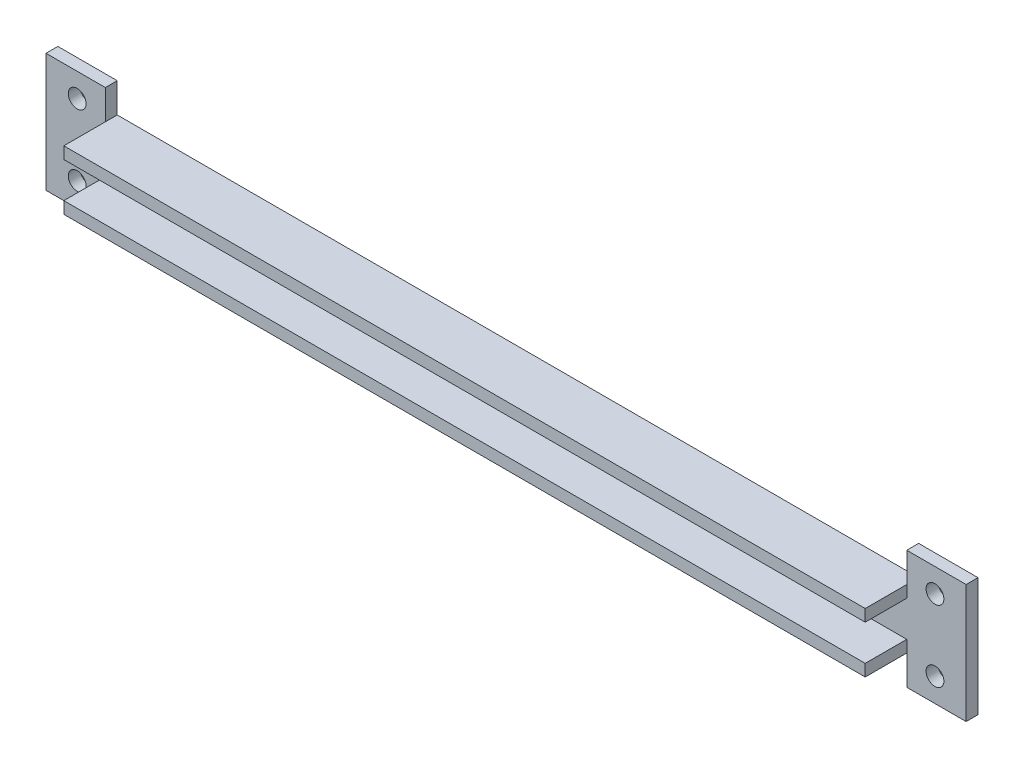
ISO-10303-21;
HEADER;
FILE_DESCRIPTION(('STEP AP214'),'2;1');
FILE_NAME('part.step','',(''),(''),'','','');
FILE_SCHEMA(('AUTOMOTIVE_DESIGN { 1 0 10303 214 1 1 1 1 }'));
ENDSEC;
DATA;
#1=APPLICATION_CONTEXT('core data for automotive mechanical design processes');
#2=APPLICATION_PROTOCOL_DEFINITION('international standard','automotive_design',2000,#1);
#3=PRODUCT_CONTEXT('',#1,'mechanical');
#4=PRODUCT('Part','Part','',(#3));
#5=PRODUCT_RELATED_PRODUCT_CATEGORY('part','',(#4));
#6=PRODUCT_DEFINITION_FORMATION('','',#4);
#7=PRODUCT_DEFINITION_CONTEXT('part definition',#1,'design');
#8=PRODUCT_DEFINITION('design','',#6,#7);
#9=PRODUCT_DEFINITION_SHAPE('','',#8);
#10=(LENGTH_UNIT() NAMED_UNIT(*) SI_UNIT(.MILLI.,.METRE.));
#11=(NAMED_UNIT(*) PLANE_ANGLE_UNIT() SI_UNIT($,.RADIAN.));
#12=(NAMED_UNIT(*) SI_UNIT($,.STERADIAN.) SOLID_ANGLE_UNIT());
#13=UNCERTAINTY_MEASURE_WITH_UNIT(LENGTH_MEASURE(1.E-05),#10,'distance_accuracy_value','');
#14=(GEOMETRIC_REPRESENTATION_CONTEXT(3) GLOBAL_UNCERTAINTY_ASSIGNED_CONTEXT((#13)) GLOBAL_UNIT_ASSIGNED_CONTEXT((#10,
#11,#12)) REPRESENTATION_CONTEXT('',''));
#15=CARTESIAN_POINT('',(0.,0.,0.));
#16=DIRECTION('',(0.,0.,1.));
#17=DIRECTION('',(1.,0.,0.));
#18=AXIS2_PLACEMENT_3D('',#15,#16,#17);
#19=CARTESIAN_POINT('',(0.,0.,9.));
#20=DIRECTION('',(0.,0.,-1.));
#21=DIRECTION('',(0.,-1.,0.));
#22=AXIS2_PLACEMENT_3D('',#19,#20,#21);
#23=PLANE('',#22);
#24=DIRECTION('',(0.,-1.,0.));
#25=VECTOR('',#24,1.);
#26=CARTESIAN_POINT('',(-73.5,23.,9.));
#27=LINE('',#26,#25);
#28=CARTESIAN_POINT('',(-73.5,25.,9.));
#29=VERTEX_POINT('',#28);
#30=CARTESIAN_POINT('',(-73.5,23.,9.));
#31=VERTEX_POINT('',#30);
#32=EDGE_CURVE('E416',#29,#31,#27,.T.);
#33=ORIENTED_EDGE('',*,*,#32,.T.);
#34=DIRECTION('',(1.,0.,0.));
#35=VECTOR('',#34,1.);
#36=CARTESIAN_POINT('',(-73.5,23.,9.));
#37=LINE('',#36,#35);
#38=CARTESIAN_POINT('',(61.5,23.,9.));
#39=VERTEX_POINT('',#38);
#40=EDGE_CURVE('E11',#31,#39,#37,.T.);
#41=ORIENTED_EDGE('',*,*,#40,.T.);
#42=DIRECTION('',(0.,1.,0.));
#43=VECTOR('',#42,1.);
#44=CARTESIAN_POINT('',(61.5,23.,9.));
#45=LINE('',#44,#43);
#46=CARTESIAN_POINT('',(61.5,25.,9.));
#47=VERTEX_POINT('',#46);
#48=EDGE_CURVE('E60',#39,#47,#45,.T.);
#49=ORIENTED_EDGE('',*,*,#48,.T.);
#50=DIRECTION('',(-1.,0.,0.));
#51=VECTOR('',#50,1.);
#52=CARTESIAN_POINT('',(-73.5,25.,9.));
#53=LINE('',#52,#51);
#54=EDGE_CURVE('E354',#47,#29,#53,.T.);
#55=ORIENTED_EDGE('',*,*,#54,.T.);
#56=EDGE_LOOP('',(#33,#41,#49,#55));
#57=FACE_BOUND('',#56,.T.);
#58=ADVANCED_FACE('F51',(#57),#23,.F.);
#59=CARTESIAN_POINT('',(-73.5,23.,0.));
#60=DIRECTION('',(0.,-1.,0.));
#61=DIRECTION('',(0.,0.,-1.));
#62=AXIS2_PLACEMENT_3D('',#59,#60,#61);
#63=PLANE('',#62);
#64=DIRECTION('',(0.,0.,1.));
#65=VECTOR('',#64,1.);
#66=CARTESIAN_POINT('',(-73.5,23.,0.));
#67=LINE('',#66,#65);
#68=CARTESIAN_POINT('',(-73.5,23.,2.));
#69=VERTEX_POINT('',#68);
#70=EDGE_CURVE('E386',#69,#31,#67,.T.);
#71=ORIENTED_EDGE('',*,*,#70,.F.);
#72=DIRECTION('',(-1.,0.,0.));
#73=VECTOR('',#72,1.);
#74=CARTESIAN_POINT('',(-73.5,23.,2.));
#75=LINE('',#74,#73);
#76=CARTESIAN_POINT('',(61.5,23.,2.));
#77=VERTEX_POINT('',#76);
#78=EDGE_CURVE('E349',#77,#69,#75,.T.);
#79=ORIENTED_EDGE('',*,*,#78,.F.);
#80=DIRECTION('',(0.,0.,1.));
#81=VECTOR('',#80,1.);
#82=CARTESIAN_POINT('',(61.5,23.,0.));
#83=LINE('',#82,#81);
#84=EDGE_CURVE('E353',#77,#39,#83,.T.);
#85=ORIENTED_EDGE('',*,*,#84,.T.);
#86=ORIENTED_EDGE('',*,*,#40,.F.);
#87=EDGE_LOOP('',(#71,#79,#85,#86));
#88=FACE_BOUND('',#87,.T.);
#89=ADVANCED_FACE('F527',(#88),#63,.T.);
#90=CARTESIAN_POINT('',(61.5,23.,0.));
#91=DIRECTION('',(1.,0.,0.));
#92=DIRECTION('',(0.,1.,0.));
#93=AXIS2_PLACEMENT_3D('',#90,#91,#92);
#94=PLANE('',#93);
#95=ORIENTED_EDGE('',*,*,#84,.F.);
#96=DIRECTION('',(0.,1.,0.));
#97=VECTOR('',#96,1.);
#98=CARTESIAN_POINT('',(61.5,4.26741975090296E-13,2.));
#99=LINE('',#98,#97);
#100=CARTESIAN_POINT('',(61.5,25.,2.));
#101=VERTEX_POINT('',#100);
#102=EDGE_CURVE('E345',#77,#101,#99,.T.);
#103=ORIENTED_EDGE('',*,*,#102,.T.);
#104=DIRECTION('',(0.,0.,1.));
#105=VECTOR('',#104,1.);
#106=CARTESIAN_POINT('',(61.5,25.,0.));
#107=LINE('',#106,#105);
#108=EDGE_CURVE('E350',#101,#47,#107,.T.);
#109=ORIENTED_EDGE('',*,*,#108,.T.);
#110=ORIENTED_EDGE('',*,*,#48,.F.);
#111=EDGE_LOOP('',(#95,#103,#109,#110));
#112=FACE_BOUND('',#111,.T.);
#113=ADVANCED_FACE('F533',(#112),#94,.T.);
#114=CARTESIAN_POINT('',(-73.5,25.,0.));
#115=DIRECTION('',(0.,1.,0.));
#116=DIRECTION('',(1.,0.,0.));
#117=AXIS2_PLACEMENT_3D('',#114,#115,#116);
#118=PLANE('',#117);
#119=DIRECTION('',(0.,0.,1.));
#120=VECTOR('',#119,1.);
#121=CARTESIAN_POINT('',(-73.5,25.,0.));
#122=LINE('',#121,#120);
#123=CARTESIAN_POINT('',(-73.5,25.,0.));
#124=VERTEX_POINT('',#123);
#125=CARTESIAN_POINT('',(-73.5,25.,2.));
#126=VERTEX_POINT('',#125);
#127=EDGE_CURVE('E266',#124,#126,#122,.T.);
#128=ORIENTED_EDGE('',*,*,#127,.T.);
#129=DIRECTION('',(0.,0.,1.));
#130=VECTOR('',#129,1.);
#131=CARTESIAN_POINT('',(-73.5,25.,0.));
#132=LINE('',#131,#130);
#133=EDGE_CURVE('E362',#126,#29,#132,.T.);
#134=ORIENTED_EDGE('',*,*,#133,.T.);
#135=ORIENTED_EDGE('',*,*,#54,.F.);
#136=ORIENTED_EDGE('',*,*,#108,.F.);
#137=DIRECTION('',(0.,0.,1.));
#138=VECTOR('',#137,1.);
#139=CARTESIAN_POINT('',(61.5,25.,0.));
#140=LINE('',#139,#138);
#141=CARTESIAN_POINT('',(61.5,25.,0.));
#142=VERTEX_POINT('',#141);
#143=EDGE_CURVE('E336',#142,#101,#140,.T.);
#144=ORIENTED_EDGE('',*,*,#143,.F.);
#145=DIRECTION('',(-1.,0.,0.));
#146=VECTOR('',#145,1.);
#147=CARTESIAN_POINT('',(-73.5,25.,0.));
#148=LINE('',#147,#146);
#149=EDGE_CURVE('E376',#142,#124,#148,.T.);
#150=ORIENTED_EDGE('',*,*,#149,.T.);
#151=EDGE_LOOP('',(#128,#134,#135,#136,#144,#150));
#152=FACE_BOUND('',#151,.T.);
#153=ADVANCED_FACE('F488',(#152),#118,.T.);
#154=CARTESIAN_POINT('',(-73.5,23.,0.));
#155=DIRECTION('',(-1.,0.,0.));
#156=DIRECTION('',(0.,1.,0.));
#157=AXIS2_PLACEMENT_3D('',#154,#155,#156);
#158=PLANE('',#157);
#159=ORIENTED_EDGE('',*,*,#133,.F.);
#160=DIRECTION('',(0.,1.,0.));
#161=VECTOR('',#160,1.);
#162=CARTESIAN_POINT('',(-73.5,30.,2.));
#163=LINE('',#162,#161);
#164=EDGE_CURVE('E358',#69,#126,#163,.T.);
#165=ORIENTED_EDGE('',*,*,#164,.F.);
#166=ORIENTED_EDGE('',*,*,#70,.T.);
#167=ORIENTED_EDGE('',*,*,#32,.F.);
#168=EDGE_LOOP('',(#159,#165,#166,#167));
#169=FACE_BOUND('',#168,.T.);
#170=ADVANCED_FACE('F523',(#169),#158,.T.);
#171=CARTESIAN_POINT('',(0.,0.,9.));
#172=DIRECTION('',(0.,0.,-1.));
#173=DIRECTION('',(0.,-1.,0.));
#174=AXIS2_PLACEMENT_3D('',#171,#172,#173);
#175=PLANE('',#174);
#176=DIRECTION('',(0.,1.,0.));
#177=VECTOR('',#176,1.);
#178=CARTESIAN_POINT('',(61.5,17.,9.));
#179=LINE('',#178,#177);
#180=CARTESIAN_POINT('',(61.5,15.,9.));
#181=VERTEX_POINT('',#180);
#182=CARTESIAN_POINT('',(61.5,17.,9.));
#183=VERTEX_POINT('',#182);
#184=EDGE_CURVE('E396',#181,#183,#179,.T.);
#185=ORIENTED_EDGE('',*,*,#184,.T.);
#186=DIRECTION('',(-1.,0.,0.));
#187=VECTOR('',#186,1.);
#188=CARTESIAN_POINT('',(61.5,17.,9.));
#189=LINE('',#188,#187);
#190=CARTESIAN_POINT('',(-73.5,17.,9.));
#191=VERTEX_POINT('',#190);
#192=EDGE_CURVE('E359',#183,#191,#189,.T.);
#193=ORIENTED_EDGE('',*,*,#192,.T.);
#194=DIRECTION('',(0.,-1.,0.));
#195=VECTOR('',#194,1.);
#196=CARTESIAN_POINT('',(-73.5,17.,9.));
#197=LINE('',#196,#195);
#198=CARTESIAN_POINT('',(-73.5,15.,9.));
#199=VERTEX_POINT('',#198);
#200=EDGE_CURVE('E363',#191,#199,#197,.T.);
#201=ORIENTED_EDGE('',*,*,#200,.T.);
#202=DIRECTION('',(1.,0.,0.));
#203=VECTOR('',#202,1.);
#204=CARTESIAN_POINT('',(61.5,15.,9.));
#205=LINE('',#204,#203);
#206=EDGE_CURVE('E400',#199,#181,#205,.T.);
#207=ORIENTED_EDGE('',*,*,#206,.T.);
#208=EDGE_LOOP('',(#185,#193,#201,#207));
#209=FACE_BOUND('',#208,.T.);
#210=ADVANCED_FACE('F545',(#209),#175,.F.);
#211=CARTESIAN_POINT('',(61.5,17.,0.));
#212=DIRECTION('',(0.,1.,0.));
#213=DIRECTION('',(1.,0.,0.));
#214=AXIS2_PLACEMENT_3D('',#211,#212,#213);
#215=PLANE('',#214);
#216=DIRECTION('',(0.,0.,1.));
#217=VECTOR('',#216,1.);
#218=CARTESIAN_POINT('',(61.5,17.,0.));
#219=LINE('',#218,#217);
#220=CARTESIAN_POINT('',(61.5,17.,2.));
#221=VERTEX_POINT('',#220);
#222=EDGE_CURVE('E390',#221,#183,#219,.T.);
#223=ORIENTED_EDGE('',*,*,#222,.F.);
#224=DIRECTION('',(1.,0.,0.));
#225=VECTOR('',#224,1.);
#226=CARTESIAN_POINT('',(-73.5,17.,2.));
#227=LINE('',#226,#225);
#228=CARTESIAN_POINT('',(-73.5,17.,2.));
#229=VERTEX_POINT('',#228);
#230=EDGE_CURVE('E346',#229,#221,#227,.T.);
#231=ORIENTED_EDGE('',*,*,#230,.F.);
#232=DIRECTION('',(0.,0.,1.));
#233=VECTOR('',#232,1.);
#234=CARTESIAN_POINT('',(-73.5,17.,0.));
#235=LINE('',#234,#233);
#236=EDGE_CURVE('E407',#229,#191,#235,.T.);
#237=ORIENTED_EDGE('',*,*,#236,.T.);
#238=ORIENTED_EDGE('',*,*,#192,.F.);
#239=EDGE_LOOP('',(#223,#231,#237,#238));
#240=FACE_BOUND('',#239,.T.);
#241=ADVANCED_FACE('F548',(#240),#215,.T.);
#242=CARTESIAN_POINT('',(-73.5,17.,0.));
#243=DIRECTION('',(-1.,0.,0.));
#244=DIRECTION('',(0.,0.,1.));
#245=AXIS2_PLACEMENT_3D('',#242,#243,#244);
#246=PLANE('',#245);
#247=ORIENTED_EDGE('',*,*,#236,.F.);
#248=DIRECTION('',(0.,-1.,0.));
#249=VECTOR('',#248,1.);
#250=CARTESIAN_POINT('',(-73.5,0.,2.));
#251=LINE('',#250,#249);
#252=CARTESIAN_POINT('',(-73.5,15.,2.));
#253=VERTEX_POINT('',#252);
#254=EDGE_CURVE('E367',#229,#253,#251,.T.);
#255=ORIENTED_EDGE('',*,*,#254,.T.);
#256=DIRECTION('',(0.,0.,1.));
#257=VECTOR('',#256,1.);
#258=CARTESIAN_POINT('',(-73.5,15.,0.));
#259=LINE('',#258,#257);
#260=EDGE_CURVE('E403',#253,#199,#259,.T.);
#261=ORIENTED_EDGE('',*,*,#260,.T.);
#262=ORIENTED_EDGE('',*,*,#200,.F.);
#263=EDGE_LOOP('',(#247,#255,#261,#262));
#264=FACE_BOUND('',#263,.T.);
#265=ADVANCED_FACE('F550',(#264),#246,.T.);
#266=CARTESIAN_POINT('',(61.5,15.,0.));
#267=DIRECTION('',(0.,-1.,0.));
#268=DIRECTION('',(0.,0.,-1.));
#269=AXIS2_PLACEMENT_3D('',#266,#267,#268);
#270=PLANE('',#269);
#271=DIRECTION('',(0.,0.,1.));
#272=VECTOR('',#271,1.);
#273=CARTESIAN_POINT('',(61.5,15.,0.));
#274=LINE('',#273,#272);
#275=CARTESIAN_POINT('',(61.5,15.,0.));
#276=VERTEX_POINT('',#275);
#277=CARTESIAN_POINT('',(61.5,15.,2.));
#278=VERTEX_POINT('',#277);
#279=EDGE_CURVE('E309',#276,#278,#274,.T.);
#280=ORIENTED_EDGE('',*,*,#279,.T.);
#281=DIRECTION('',(0.,0.,1.));
#282=VECTOR('',#281,1.);
#283=CARTESIAN_POINT('',(61.5,15.,0.));
#284=LINE('',#283,#282);
#285=EDGE_CURVE('E382',#278,#181,#284,.T.);
#286=ORIENTED_EDGE('',*,*,#285,.T.);
#287=ORIENTED_EDGE('',*,*,#206,.F.);
#288=ORIENTED_EDGE('',*,*,#260,.F.);
#289=DIRECTION('',(0.,0.,1.));
#290=VECTOR('',#289,1.);
#291=CARTESIAN_POINT('',(-73.5,15.,0.));
#292=LINE('',#291,#290);
#293=CARTESIAN_POINT('',(-73.5,15.,0.));
#294=VERTEX_POINT('',#293);
#295=EDGE_CURVE('E283',#294,#253,#292,.T.);
#296=ORIENTED_EDGE('',*,*,#295,.F.);
#297=DIRECTION('',(1.,0.,0.));
#298=VECTOR('',#297,1.);
#299=CARTESIAN_POINT('',(61.5,15.,0.));
#300=LINE('',#299,#298);
#301=EDGE_CURVE('E379',#294,#276,#300,.T.);
#302=ORIENTED_EDGE('',*,*,#301,.T.);
#303=EDGE_LOOP('',(#280,#286,#287,#288,#296,#302));
#304=FACE_BOUND('',#303,.T.);
#305=ADVANCED_FACE('F500',(#304),#270,.T.);
#306=CARTESIAN_POINT('',(61.5,17.,0.));
#307=DIRECTION('',(1.,0.,0.));
#308=DIRECTION('',(0.,1.,0.));
#309=AXIS2_PLACEMENT_3D('',#306,#307,#308);
#310=PLANE('',#309);
#311=ORIENTED_EDGE('',*,*,#285,.F.);
#312=DIRECTION('',(0.,-1.,0.));
#313=VECTOR('',#312,1.);
#314=CARTESIAN_POINT('',(61.5,17.,2.));
#315=LINE('',#314,#313);
#316=EDGE_CURVE('E341',#221,#278,#315,.T.);
#317=ORIENTED_EDGE('',*,*,#316,.F.);
#318=ORIENTED_EDGE('',*,*,#222,.T.);
#319=ORIENTED_EDGE('',*,*,#184,.F.);
#320=EDGE_LOOP('',(#311,#317,#318,#319));
#321=FACE_BOUND('',#320,.T.);
#322=ADVANCED_FACE('F479',(#321),#310,.T.);
#323=CARTESIAN_POINT('',(0.,0.,0.));
#324=DIRECTION('',(0.,0.,1.));
#325=DIRECTION('',(1.,0.,0.));
#326=AXIS2_PLACEMENT_3D('',#323,#324,#325);
#327=PLANE('',#326);
#328=CARTESIAN_POINT('',(-78.25,14.,0.));
#329=DIRECTION('',(0.,0.,-1.));
#330=DIRECTION('',(-1.,0.,0.));
#331=AXIS2_PLACEMENT_3D('',#328,#329,#330);
#332=CIRCLE('',#331,1.5);
#333=CARTESIAN_POINT('',(-79.75,14.,0.));
#334=VERTEX_POINT('',#333);
#335=EDGE_CURVE('E471',#334,#334,#332,.T.);
#336=ORIENTED_EDGE('',*,*,#335,.F.);
#337=EDGE_LOOP('',(#336));
#338=FACE_BOUND('',#337,.T.);
#339=CARTESIAN_POINT('',(-78.25,26.,0.));
#340=DIRECTION('',(0.,0.,-1.));
#341=DIRECTION('',(-1.,0.,0.));
#342=AXIS2_PLACEMENT_3D('',#339,#340,#341);
#343=CIRCLE('',#342,1.5);
#344=CARTESIAN_POINT('',(-79.75,26.,0.));
#345=VERTEX_POINT('',#344);
#346=EDGE_CURVE('E465',#345,#345,#343,.T.);
#347=ORIENTED_EDGE('',*,*,#346,.F.);
#348=EDGE_LOOP('',(#347));
#349=FACE_BOUND('',#348,.T.);
#350=CARTESIAN_POINT('',(66.25,26.,0.));
#351=DIRECTION('',(0.,0.,-1.));
#352=DIRECTION('',(-1.,0.,0.));
#353=AXIS2_PLACEMENT_3D('',#350,#351,#352);
#354=CIRCLE('',#353,1.5);
#355=CARTESIAN_POINT('',(64.75,26.,0.));
#356=VERTEX_POINT('',#355);
#357=EDGE_CURVE('E462',#356,#356,#354,.T.);
#358=ORIENTED_EDGE('',*,*,#357,.F.);
#359=EDGE_LOOP('',(#358));
#360=FACE_BOUND('',#359,.T.);
#361=CARTESIAN_POINT('',(66.25,14.,0.));
#362=DIRECTION('',(0.,0.,-1.));
#363=DIRECTION('',(-1.,0.,0.));
#364=AXIS2_PLACEMENT_3D('',#361,#362,#363);
#365=CIRCLE('',#364,1.5);
#366=CARTESIAN_POINT('',(64.75,14.,0.));
#367=VERTEX_POINT('',#366);
#368=EDGE_CURVE('E242',#367,#367,#365,.T.);
#369=ORIENTED_EDGE('',*,*,#368,.F.);
#370=EDGE_LOOP('',(#369));
#371=FACE_BOUND('',#370,.T.);
#372=ORIENTED_EDGE('',*,*,#149,.F.);
#373=DIRECTION('',(0.,-1.,0.));
#374=VECTOR('',#373,1.);
#375=CARTESIAN_POINT('',(61.5,23.,0.));
#376=LINE('',#375,#374);
#377=CARTESIAN_POINT('',(61.5,30.,0.));
#378=VERTEX_POINT('',#377);
#379=EDGE_CURVE('E219',#378,#142,#376,.T.);
#380=ORIENTED_EDGE('',*,*,#379,.F.);
#381=DIRECTION('',(-1.,0.,0.));
#382=VECTOR('',#381,1.);
#383=CARTESIAN_POINT('',(61.5,30.,0.));
#384=LINE('',#383,#382);
#385=CARTESIAN_POINT('',(71.5,30.,0.));
#386=VERTEX_POINT('',#385);
#387=EDGE_CURVE('E328',#386,#378,#384,.T.);
#388=ORIENTED_EDGE('',*,*,#387,.F.);
#389=DIRECTION('',(0.,-1.,0.));
#390=VECTOR('',#389,1.);
#391=CARTESIAN_POINT('',(71.5,9.99999999999999,0.));
#392=LINE('',#391,#390);
#393=CARTESIAN_POINT('',(71.5,9.99999999999999,0.));
#394=VERTEX_POINT('',#393);
#395=EDGE_CURVE('E227',#386,#394,#392,.T.);
#396=ORIENTED_EDGE('',*,*,#395,.T.);
#397=DIRECTION('',(1.,0.,0.));
#398=VECTOR('',#397,1.);
#399=CARTESIAN_POINT('',(61.5,10.,0.));
#400=LINE('',#399,#398);
#401=CARTESIAN_POINT('',(61.5,10.,0.));
#402=VERTEX_POINT('',#401);
#403=EDGE_CURVE('E320',#402,#394,#400,.T.);
#404=ORIENTED_EDGE('',*,*,#403,.F.);
#405=DIRECTION('',(0.,-1.,0.));
#406=VECTOR('',#405,1.);
#407=CARTESIAN_POINT('',(61.5,17.,0.));
#408=LINE('',#407,#406);
#409=EDGE_CURVE('E313',#276,#402,#408,.T.);
#410=ORIENTED_EDGE('',*,*,#409,.F.);
#411=ORIENTED_EDGE('',*,*,#301,.F.);
#412=DIRECTION('',(0.,1.,0.));
#413=VECTOR('',#412,1.);
#414=CARTESIAN_POINT('',(-73.5,10.,0.));
#415=LINE('',#414,#413);
#416=CARTESIAN_POINT('',(-73.5,10.,0.));
#417=VERTEX_POINT('',#416);
#418=EDGE_CURVE('E279',#417,#294,#415,.T.);
#419=ORIENTED_EDGE('',*,*,#418,.F.);
#420=DIRECTION('',(1.,0.,0.));
#421=VECTOR('',#420,1.);
#422=CARTESIAN_POINT('',(-78.5,10.,0.));
#423=LINE('',#422,#421);
#424=CARTESIAN_POINT('',(-83.5,10.,0.));
#425=VERTEX_POINT('',#424);
#426=EDGE_CURVE('E292',#425,#417,#423,.T.);
#427=ORIENTED_EDGE('',*,*,#426,.F.);
#428=DIRECTION('',(0.,1.,0.));
#429=VECTOR('',#428,1.);
#430=CARTESIAN_POINT('',(-83.5,10.,0.));
#431=LINE('',#430,#429);
#432=CARTESIAN_POINT('',(-83.5,30.,0.));
#433=VERTEX_POINT('',#432);
#434=EDGE_CURVE('E239',#425,#433,#431,.T.);
#435=ORIENTED_EDGE('',*,*,#434,.T.);
#436=DIRECTION('',(-1.,0.,0.));
#437=VECTOR('',#436,1.);
#438=CARTESIAN_POINT('',(-78.5,30.,0.));
#439=LINE('',#438,#437);
#440=CARTESIAN_POINT('',(-73.5,30.,0.));
#441=VERTEX_POINT('',#440);
#442=EDGE_CURVE('E278',#441,#433,#439,.T.);
#443=ORIENTED_EDGE('',*,*,#442,.F.);
#444=DIRECTION('',(0.,1.,0.));
#445=VECTOR('',#444,1.);
#446=CARTESIAN_POINT('',(-73.5,30.,0.));
#447=LINE('',#446,#445);
#448=EDGE_CURVE('E270',#124,#441,#447,.T.);
#449=ORIENTED_EDGE('',*,*,#448,.F.);
#450=EDGE_LOOP('',(#372,#380,#388,#396,#404,#410,#411,#419,#427,#435,#443,#449));
#451=FACE_BOUND('',#450,.T.);
#452=ADVANCED_FACE('F446',(#338,#349,#360,#371,#451),#327,.F.);
#453=CARTESIAN_POINT('',(0.,0.,2.));
#454=DIRECTION('',(0.,0.,1.));
#455=DIRECTION('',(1.,0.,0.));
#456=AXIS2_PLACEMENT_3D('',#453,#454,#455);
#457=PLANE('',#456);
#458=CARTESIAN_POINT('',(-78.25,14.,2.));
#459=DIRECTION('',(0.,0.,1.));
#460=DIRECTION('',(1.,0.,0.));
#461=AXIS2_PLACEMENT_3D('',#458,#459,#460);
#462=CIRCLE('',#461,1.5);
#463=CARTESIAN_POINT('',(-76.75,14.,2.));
#464=VERTEX_POINT('',#463);
#465=EDGE_CURVE('E54',#464,#464,#462,.T.);
#466=ORIENTED_EDGE('',*,*,#465,.F.);
#467=EDGE_LOOP('',(#466));
#468=FACE_BOUND('',#467,.T.);
#469=CARTESIAN_POINT('',(-78.25,26.,2.));
#470=DIRECTION('',(0.,0.,1.));
#471=DIRECTION('',(1.,0.,0.));
#472=AXIS2_PLACEMENT_3D('',#469,#470,#471);
#473=CIRCLE('',#472,1.5);
#474=CARTESIAN_POINT('',(-76.75,26.,2.));
#475=VERTEX_POINT('',#474);
#476=EDGE_CURVE('E431',#475,#475,#473,.T.);
#477=ORIENTED_EDGE('',*,*,#476,.F.);
#478=EDGE_LOOP('',(#477));
#479=FACE_BOUND('',#478,.T.);
#480=CARTESIAN_POINT('',(66.25,26.,2.));
#481=DIRECTION('',(0.,0.,1.));
#482=DIRECTION('',(1.,0.,0.));
#483=AXIS2_PLACEMENT_3D('',#480,#481,#482);
#484=CIRCLE('',#483,1.5);
#485=CARTESIAN_POINT('',(67.75,26.,2.));
#486=VERTEX_POINT('',#485);
#487=EDGE_CURVE('E428',#486,#486,#484,.T.);
#488=ORIENTED_EDGE('',*,*,#487,.F.);
#489=EDGE_LOOP('',(#488));
#490=FACE_BOUND('',#489,.T.);
#491=CARTESIAN_POINT('',(66.25,14.,2.));
#492=DIRECTION('',(0.,0.,1.));
#493=DIRECTION('',(1.,0.,0.));
#494=AXIS2_PLACEMENT_3D('',#491,#492,#493);
#495=CIRCLE('',#494,1.5);
#496=CARTESIAN_POINT('',(67.75,14.,2.));
#497=VERTEX_POINT('',#496);
#498=EDGE_CURVE('E424',#497,#497,#495,.T.);
#499=ORIENTED_EDGE('',*,*,#498,.F.);
#500=EDGE_LOOP('',(#499));
#501=FACE_BOUND('',#500,.T.);
#502=ORIENTED_EDGE('',*,*,#230,.T.);
#503=ORIENTED_EDGE('',*,*,#316,.T.);
#504=DIRECTION('',(0.,-1.,0.));
#505=VECTOR('',#504,1.);
#506=CARTESIAN_POINT('',(61.5,17.,2.));
#507=LINE('',#506,#505);
#508=CARTESIAN_POINT('',(61.5,10.,2.));
#509=VERTEX_POINT('',#508);
#510=EDGE_CURVE('E308',#278,#509,#507,.T.);
#511=ORIENTED_EDGE('',*,*,#510,.T.);
#512=DIRECTION('',(1.,0.,0.));
#513=VECTOR('',#512,1.);
#514=CARTESIAN_POINT('',(61.5,10.,2.));
#515=LINE('',#514,#513);
#516=CARTESIAN_POINT('',(71.5,9.99999999999999,2.));
#517=VERTEX_POINT('',#516);
#518=EDGE_CURVE('E234',#509,#517,#515,.T.);
#519=ORIENTED_EDGE('',*,*,#518,.T.);
#520=DIRECTION('',(0.,-1.,0.));
#521=VECTOR('',#520,1.);
#522=CARTESIAN_POINT('',(71.5,9.99999999999999,2.));
#523=LINE('',#522,#521);
#524=CARTESIAN_POINT('',(71.5,30.,2.));
#525=VERTEX_POINT('',#524);
#526=EDGE_CURVE('E225',#525,#517,#523,.T.);
#527=ORIENTED_EDGE('',*,*,#526,.F.);
#528=DIRECTION('',(-1.,0.,0.));
#529=VECTOR('',#528,1.);
#530=CARTESIAN_POINT('',(61.5,30.,2.));
#531=LINE('',#530,#529);
#532=CARTESIAN_POINT('',(61.5,30.,2.));
#533=VERTEX_POINT('',#532);
#534=EDGE_CURVE('E207',#525,#533,#531,.T.);
#535=ORIENTED_EDGE('',*,*,#534,.T.);
#536=DIRECTION('',(0.,-1.,0.));
#537=VECTOR('',#536,1.);
#538=CARTESIAN_POINT('',(61.5,23.,2.));
#539=LINE('',#538,#537);
#540=EDGE_CURVE('E340',#533,#101,#539,.T.);
#541=ORIENTED_EDGE('',*,*,#540,.T.);
#542=ORIENTED_EDGE('',*,*,#102,.F.);
#543=ORIENTED_EDGE('',*,*,#78,.T.);
#544=ORIENTED_EDGE('',*,*,#164,.T.);
#545=DIRECTION('',(0.,1.,0.));
#546=VECTOR('',#545,1.);
#547=CARTESIAN_POINT('',(-73.5,30.,2.));
#548=LINE('',#547,#546);
#549=CARTESIAN_POINT('',(-73.5,30.,2.));
#550=VERTEX_POINT('',#549);
#551=EDGE_CURVE('E246',#126,#550,#548,.T.);
#552=ORIENTED_EDGE('',*,*,#551,.T.);
#553=DIRECTION('',(-1.,0.,0.));
#554=VECTOR('',#553,1.);
#555=CARTESIAN_POINT('',(-78.5,30.,2.));
#556=LINE('',#555,#554);
#557=CARTESIAN_POINT('',(-83.5,30.,2.));
#558=VERTEX_POINT('',#557);
#559=EDGE_CURVE('E287',#550,#558,#556,.T.);
#560=ORIENTED_EDGE('',*,*,#559,.T.);
#561=DIRECTION('',(0.,1.,0.));
#562=VECTOR('',#561,1.);
#563=CARTESIAN_POINT('',(-83.5,10.,2.));
#564=LINE('',#563,#562);
#565=CARTESIAN_POINT('',(-83.5,10.,2.));
#566=VERTEX_POINT('',#565);
#567=EDGE_CURVE('E252',#566,#558,#564,.T.);
#568=ORIENTED_EDGE('',*,*,#567,.F.);
#569=DIRECTION('',(1.,0.,0.));
#570=VECTOR('',#569,1.);
#571=CARTESIAN_POINT('',(-78.5,10.,2.));
#572=LINE('',#571,#570);
#573=CARTESIAN_POINT('',(-73.5,10.,2.));
#574=VERTEX_POINT('',#573);
#575=EDGE_CURVE('E284',#566,#574,#572,.T.);
#576=ORIENTED_EDGE('',*,*,#575,.T.);
#577=DIRECTION('',(0.,1.,0.));
#578=VECTOR('',#577,1.);
#579=CARTESIAN_POINT('',(-73.5,10.,2.));
#580=LINE('',#579,#578);
#581=EDGE_CURVE('E301',#574,#253,#580,.T.);
#582=ORIENTED_EDGE('',*,*,#581,.T.);
#583=ORIENTED_EDGE('',*,*,#254,.F.);
#584=EDGE_LOOP('',(#502,#503,#511,#519,#527,#535,#541,#542,#543,#544,#552,#560,#568,#576,#582,#583));
#585=FACE_BOUND('',#584,.T.);
#586=ADVANCED_FACE('F232',(#468,#479,#490,#501,#585),#457,.T.);
#587=CARTESIAN_POINT('',(61.5,23.,2.));
#588=DIRECTION('',(1.,0.,0.));
#589=DIRECTION('',(0.,1.,0.));
#590=AXIS2_PLACEMENT_3D('',#587,#588,#589);
#591=PLANE('',#590);
#592=ORIENTED_EDGE('',*,*,#379,.T.);
#593=ORIENTED_EDGE('',*,*,#143,.T.);
#594=ORIENTED_EDGE('',*,*,#540,.F.);
#595=DIRECTION('',(0.,0.,-1.));
#596=VECTOR('',#595,1.);
#597=CARTESIAN_POINT('',(61.5,30.,2.));
#598=LINE('',#597,#596);
#599=EDGE_CURVE('E214',#533,#378,#598,.T.);
#600=ORIENTED_EDGE('',*,*,#599,.T.);
#601=EDGE_LOOP('',(#592,#593,#594,#600));
#602=FACE_BOUND('',#601,.T.);
#603=ADVANCED_FACE('F445',(#602),#591,.F.);
#604=CARTESIAN_POINT('',(61.5,30.,2.));
#605=DIRECTION('',(0.,-1.,0.));
#606=DIRECTION('',(0.,0.,-1.));
#607=AXIS2_PLACEMENT_3D('',#604,#605,#606);
#608=PLANE('',#607);
#609=ORIENTED_EDGE('',*,*,#387,.T.);
#610=ORIENTED_EDGE('',*,*,#599,.F.);
#611=ORIENTED_EDGE('',*,*,#534,.F.);
#612=DIRECTION('',(0.,0.,-1.));
#613=VECTOR('',#612,1.);
#614=CARTESIAN_POINT('',(71.5,30.,2.));
#615=LINE('',#614,#613);
#616=EDGE_CURVE('E211',#525,#386,#615,.T.);
#617=ORIENTED_EDGE('',*,*,#616,.T.);
#618=EDGE_LOOP('',(#609,#610,#611,#617));
#619=FACE_BOUND('',#618,.T.);
#620=ADVANCED_FACE('F210',(#619),#608,.F.);
#621=CARTESIAN_POINT('',(61.5,10.,2.));
#622=DIRECTION('',(0.,1.,0.));
#623=DIRECTION('',(1.,0.,0.));
#624=AXIS2_PLACEMENT_3D('',#621,#622,#623);
#625=PLANE('',#624);
#626=ORIENTED_EDGE('',*,*,#403,.T.);
#627=DIRECTION('',(0.,0.,-1.));
#628=VECTOR('',#627,1.);
#629=CARTESIAN_POINT('',(71.5,9.99999999999999,2.));
#630=LINE('',#629,#628);
#631=EDGE_CURVE('E229',#517,#394,#630,.T.);
#632=ORIENTED_EDGE('',*,*,#631,.F.);
#633=ORIENTED_EDGE('',*,*,#518,.F.);
#634=DIRECTION('',(0.,0.,-1.));
#635=VECTOR('',#634,1.);
#636=CARTESIAN_POINT('',(61.5,10.,2.));
#637=LINE('',#636,#635);
#638=EDGE_CURVE('E319',#509,#402,#637,.T.);
#639=ORIENTED_EDGE('',*,*,#638,.T.);
#640=EDGE_LOOP('',(#626,#632,#633,#639));
#641=FACE_BOUND('',#640,.T.);
#642=ADVANCED_FACE('F495',(#641),#625,.F.);
#643=CARTESIAN_POINT('',(61.5,17.,2.));
#644=DIRECTION('',(1.,0.,0.));
#645=DIRECTION('',(0.,1.,0.));
#646=AXIS2_PLACEMENT_3D('',#643,#644,#645);
#647=PLANE('',#646);
#648=ORIENTED_EDGE('',*,*,#510,.F.);
#649=ORIENTED_EDGE('',*,*,#279,.F.);
#650=ORIENTED_EDGE('',*,*,#409,.T.);
#651=ORIENTED_EDGE('',*,*,#638,.F.);
#652=EDGE_LOOP('',(#648,#649,#650,#651));
#653=FACE_BOUND('',#652,.T.);
#654=ADVANCED_FACE('F498',(#653),#647,.F.);
#655=CARTESIAN_POINT('',(-73.5,10.,2.));
#656=DIRECTION('',(-1.,0.,0.));
#657=DIRECTION('',(0.,0.,1.));
#658=AXIS2_PLACEMENT_3D('',#655,#656,#657);
#659=PLANE('',#658);
#660=ORIENTED_EDGE('',*,*,#418,.T.);
#661=ORIENTED_EDGE('',*,*,#295,.T.);
#662=ORIENTED_EDGE('',*,*,#581,.F.);
#663=DIRECTION('',(0.,0.,-1.));
#664=VECTOR('',#663,1.);
#665=CARTESIAN_POINT('',(-73.5,10.,2.));
#666=LINE('',#665,#664);
#667=EDGE_CURVE('E288',#574,#417,#666,.T.);
#668=ORIENTED_EDGE('',*,*,#667,.T.);
#669=EDGE_LOOP('',(#660,#661,#662,#668));
#670=FACE_BOUND('',#669,.T.);
#671=ADVANCED_FACE('F505',(#670),#659,.F.);
#672=CARTESIAN_POINT('',(-78.5,10.,2.));
#673=DIRECTION('',(0.,1.,0.));
#674=DIRECTION('',(1.,0.,0.));
#675=AXIS2_PLACEMENT_3D('',#672,#673,#674);
#676=PLANE('',#675);
#677=ORIENTED_EDGE('',*,*,#426,.T.);
#678=ORIENTED_EDGE('',*,*,#667,.F.);
#679=ORIENTED_EDGE('',*,*,#575,.F.);
#680=DIRECTION('',(0.,0.,-1.));
#681=VECTOR('',#680,1.);
#682=CARTESIAN_POINT('',(-83.5,10.,2.));
#683=LINE('',#682,#681);
#684=EDGE_CURVE('E248',#566,#425,#683,.T.);
#685=ORIENTED_EDGE('',*,*,#684,.T.);
#686=EDGE_LOOP('',(#677,#678,#679,#685));
#687=FACE_BOUND('',#686,.T.);
#688=ADVANCED_FACE('F507',(#687),#676,.F.);
#689=CARTESIAN_POINT('',(-78.5,30.,2.));
#690=DIRECTION('',(0.,-1.,0.));
#691=DIRECTION('',(0.,0.,-1.));
#692=AXIS2_PLACEMENT_3D('',#689,#690,#691);
#693=PLANE('',#692);
#694=ORIENTED_EDGE('',*,*,#442,.T.);
#695=DIRECTION('',(0.,0.,-1.));
#696=VECTOR('',#695,1.);
#697=CARTESIAN_POINT('',(-83.5,30.,2.));
#698=LINE('',#697,#696);
#699=EDGE_CURVE('E253',#558,#433,#698,.T.);
#700=ORIENTED_EDGE('',*,*,#699,.F.);
#701=ORIENTED_EDGE('',*,*,#559,.F.);
#702=DIRECTION('',(0.,0.,-1.));
#703=VECTOR('',#702,1.);
#704=CARTESIAN_POINT('',(-73.5,30.,2.));
#705=LINE('',#704,#703);
#706=EDGE_CURVE('E274',#550,#441,#705,.T.);
#707=ORIENTED_EDGE('',*,*,#706,.T.);
#708=EDGE_LOOP('',(#694,#700,#701,#707));
#709=FACE_BOUND('',#708,.T.);
#710=ADVANCED_FACE('F516',(#709),#693,.F.);
#711=CARTESIAN_POINT('',(-73.5,30.,2.));
#712=DIRECTION('',(-1.,0.,0.));
#713=DIRECTION('',(0.,0.,1.));
#714=AXIS2_PLACEMENT_3D('',#711,#712,#713);
#715=PLANE('',#714);
#716=ORIENTED_EDGE('',*,*,#551,.F.);
#717=ORIENTED_EDGE('',*,*,#127,.F.);
#718=ORIENTED_EDGE('',*,*,#448,.T.);
#719=ORIENTED_EDGE('',*,*,#706,.F.);
#720=EDGE_LOOP('',(#716,#717,#718,#719));
#721=FACE_BOUND('',#720,.T.);
#722=ADVANCED_FACE('F519',(#721),#715,.F.);
#723=CARTESIAN_POINT('',(-83.5,10.,2.));
#724=DIRECTION('',(-1.,0.,0.));
#725=DIRECTION('',(0.,0.,1.));
#726=AXIS2_PLACEMENT_3D('',#723,#724,#725);
#727=PLANE('',#726);
#728=ORIENTED_EDGE('',*,*,#434,.F.);
#729=ORIENTED_EDGE('',*,*,#684,.F.);
#730=ORIENTED_EDGE('',*,*,#567,.T.);
#731=ORIENTED_EDGE('',*,*,#699,.T.);
#732=EDGE_LOOP('',(#728,#729,#730,#731));
#733=FACE_BOUND('',#732,.T.);
#734=ADVANCED_FACE('F512',(#733),#727,.T.);
#735=CARTESIAN_POINT('',(71.5,9.99999999999999,2.));
#736=DIRECTION('',(1.,0.,0.));
#737=DIRECTION('',(0.,0.,-1.));
#738=AXIS2_PLACEMENT_3D('',#735,#736,#737);
#739=PLANE('',#738);
#740=ORIENTED_EDGE('',*,*,#395,.F.);
#741=ORIENTED_EDGE('',*,*,#616,.F.);
#742=ORIENTED_EDGE('',*,*,#526,.T.);
#743=ORIENTED_EDGE('',*,*,#631,.T.);
#744=EDGE_LOOP('',(#740,#741,#742,#743));
#745=FACE_BOUND('',#744,.T.);
#746=ADVANCED_FACE('F223',(#745),#739,.T.);
#747=CARTESIAN_POINT('',(66.25,14.,9.));
#748=DIRECTION('',(0.,0.,-1.));
#749=DIRECTION('',(-1.,0.,0.));
#750=AXIS2_PLACEMENT_3D('',#747,#748,#749);
#751=CYLINDRICAL_SURFACE('',#750,1.5);
#752=ORIENTED_EDGE('',*,*,#498,.T.);
#753=EDGE_LOOP('',(#752));
#754=FACE_BOUND('',#753,.T.);
#755=ORIENTED_EDGE('',*,*,#368,.T.);
#756=EDGE_LOOP('',(#755));
#757=FACE_BOUND('',#756,.T.);
#758=ADVANCED_FACE('F453',(#754,#757),#751,.F.);
#759=CARTESIAN_POINT('',(66.25,26.,9.));
#760=DIRECTION('',(0.,0.,-1.));
#761=DIRECTION('',(-1.,0.,0.));
#762=AXIS2_PLACEMENT_3D('',#759,#760,#761);
#763=CYLINDRICAL_SURFACE('',#762,1.5);
#764=ORIENTED_EDGE('',*,*,#487,.T.);
#765=EDGE_LOOP('',(#764));
#766=FACE_BOUND('',#765,.T.);
#767=ORIENTED_EDGE('',*,*,#357,.T.);
#768=EDGE_LOOP('',(#767));
#769=FACE_BOUND('',#768,.T.);
#770=ADVANCED_FACE('F456',(#766,#769),#763,.F.);
#771=CARTESIAN_POINT('',(-78.25,26.,9.));
#772=DIRECTION('',(0.,0.,-1.));
#773=DIRECTION('',(-1.,0.,0.));
#774=AXIS2_PLACEMENT_3D('',#771,#772,#773);
#775=CYLINDRICAL_SURFACE('',#774,1.5);
#776=ORIENTED_EDGE('',*,*,#476,.T.);
#777=EDGE_LOOP('',(#776));
#778=FACE_BOUND('',#777,.T.);
#779=ORIENTED_EDGE('',*,*,#346,.T.);
#780=EDGE_LOOP('',(#779));
#781=FACE_BOUND('',#780,.T.);
#782=ADVANCED_FACE('F584',(#778,#781),#775,.F.);
#783=CARTESIAN_POINT('',(-78.25,14.,9.));
#784=DIRECTION('',(0.,0.,-1.));
#785=DIRECTION('',(-1.,0.,0.));
#786=AXIS2_PLACEMENT_3D('',#783,#784,#785);
#787=CYLINDRICAL_SURFACE('',#786,1.5);
#788=ORIENTED_EDGE('',*,*,#465,.T.);
#789=EDGE_LOOP('',(#788));
#790=FACE_BOUND('',#789,.T.);
#791=ORIENTED_EDGE('',*,*,#335,.T.);
#792=EDGE_LOOP('',(#791));
#793=FACE_BOUND('',#792,.T.);
#794=ADVANCED_FACE('F440',(#790,#793),#787,.F.);
#795=CLOSED_SHELL('',(#58,#89,#113,#153,#170,#210,#241,#265,#305,#322,#452,#586,#603,#620,#642,
#654,#671,#688,#710,#722,#734,#746,#758,#770,#782,#794));
#796=MANIFOLD_SOLID_BREP('B2',#795);
#797=ADVANCED_BREP_SHAPE_REPRESENTATION('',(#18,#796),#14);
#798=SHAPE_DEFINITION_REPRESENTATION(#9,#797);
ENDSEC;
END-ISO-10303-21;
